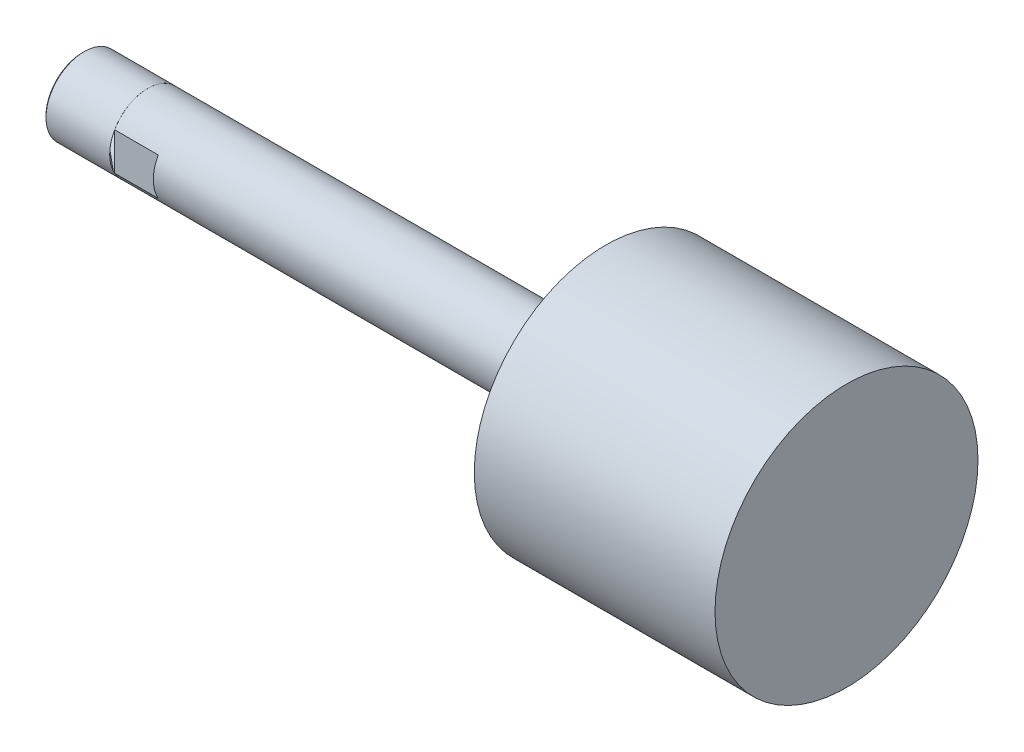
ISO-10303-21;
HEADER;
FILE_DESCRIPTION(('STEP AP214'),'2;1');
FILE_NAME('part.step','',(''),(''),'','','');
FILE_SCHEMA(('AUTOMOTIVE_DESIGN { 1 0 10303 214 1 1 1 1 }'));
ENDSEC;
DATA;
#1=APPLICATION_CONTEXT('core data for automotive mechanical design processes');
#2=APPLICATION_PROTOCOL_DEFINITION('international standard','automotive_design',2000,#1);
#3=PRODUCT_CONTEXT('',#1,'mechanical');
#4=PRODUCT('Part','Part','',(#3));
#5=PRODUCT_RELATED_PRODUCT_CATEGORY('part','',(#4));
#6=PRODUCT_DEFINITION_FORMATION('','',#4);
#7=PRODUCT_DEFINITION_CONTEXT('part definition',#1,'design');
#8=PRODUCT_DEFINITION('design','',#6,#7);
#9=PRODUCT_DEFINITION_SHAPE('','',#8);
#10=(LENGTH_UNIT() NAMED_UNIT(*) SI_UNIT(.MILLI.,.METRE.));
#11=(NAMED_UNIT(*) PLANE_ANGLE_UNIT() SI_UNIT($,.RADIAN.));
#12=(NAMED_UNIT(*) SI_UNIT($,.STERADIAN.) SOLID_ANGLE_UNIT());
#13=UNCERTAINTY_MEASURE_WITH_UNIT(LENGTH_MEASURE(1.E-05),#10,'distance_accuracy_value','');
#14=(GEOMETRIC_REPRESENTATION_CONTEXT(3) GLOBAL_UNCERTAINTY_ASSIGNED_CONTEXT((#13)) GLOBAL_UNIT_ASSIGNED_CONTEXT((#10,
#11,#12)) REPRESENTATION_CONTEXT('',''));
#15=CARTESIAN_POINT('',(0.,0.,0.));
#16=DIRECTION('',(0.,0.,1.));
#17=DIRECTION('',(1.,0.,0.));
#18=AXIS2_PLACEMENT_3D('',#15,#16,#17);
#19=CARTESIAN_POINT('',(-6.35,0.,0.));
#20=DIRECTION('',(-1.,0.,0.));
#21=DIRECTION('',(0.,0.,1.));
#22=AXIS2_PLACEMENT_3D('',#19,#20,#21);
#23=CYLINDRICAL_SURFACE('',#22,5.55625);
#24=CARTESIAN_POINT('',(-15.621,0.,0.));
#25=DIRECTION('',(-1.,0.,0.));
#26=DIRECTION('',(0.,0.,1.));
#27=AXIS2_PLACEMENT_3D('',#24,#25,#26);
#28=CIRCLE('',#27,5.55625);
#29=CARTESIAN_POINT('',(-15.621,0.,5.55625));
#30=VERTEX_POINT('',#29);
#31=EDGE_CURVE('E44',#30,#30,#28,.F.);
#32=ORIENTED_EDGE('',*,*,#31,.T.);
#33=EDGE_LOOP('',(#32));
#34=FACE_BOUND('',#33,.T.);
#35=CARTESIAN_POINT('',(-6.35,0.,0.));
#36=DIRECTION('',(-1.,0.,0.));
#37=DIRECTION('',(0.,0.,1.));
#38=AXIS2_PLACEMENT_3D('',#35,#36,#37);
#39=CIRCLE('',#38,5.55625);
#40=CARTESIAN_POINT('',(-6.35,0.,5.55625));
#41=VERTEX_POINT('',#40);
#42=EDGE_CURVE('E82',#41,#41,#39,.T.);
#43=ORIENTED_EDGE('',*,*,#42,.T.);
#44=EDGE_LOOP('',(#43));
#45=FACE_BOUND('',#44,.T.);
#46=ADVANCED_FACE('F35',(#34,#45),#23,.T.);
#47=CARTESIAN_POINT('',(0.,0.,0.));
#48=DIRECTION('',(1.,0.,0.));
#49=DIRECTION('',(0.,0.,-1.));
#50=AXIS2_PLACEMENT_3D('',#47,#48,#49);
#51=PLANE('',#50);
#52=CARTESIAN_POINT('',(0.,0.,0.));
#53=DIRECTION('',(-1.,0.,0.));
#54=DIRECTION('',(0.,0.,1.));
#55=AXIS2_PLACEMENT_3D('',#52,#53,#54);
#56=CIRCLE('',#55,5.5499);
#57=CARTESIAN_POINT('',(0.,2.74064116768321,4.826));
#58=VERTEX_POINT('',#57);
#59=CARTESIAN_POINT('',(0.,-2.74064116768321,4.826));
#60=VERTEX_POINT('',#59);
#61=EDGE_CURVE('E91',#58,#60,#56,.F.);
#62=ORIENTED_EDGE('',*,*,#61,.F.);
#63=DIRECTION('',(0.,1.,0.));
#64=VECTOR('',#63,1.);
#65=CARTESIAN_POINT('',(0.,5.5499,4.826));
#66=LINE('',#65,#64);
#67=EDGE_CURVE('E83',#58,#60,#66,.F.);
#68=ORIENTED_EDGE('',*,*,#67,.T.);
#69=EDGE_LOOP('',(#62,#68));
#70=FACE_BOUND('',#69,.T.);
#71=ADVANCED_FACE('F128',(#70),#51,.F.);
#72=CARTESIAN_POINT('',(0.,5.5499,4.826));
#73=DIRECTION('',(0.,0.,-1.));
#74=DIRECTION('',(-1.,0.,0.));
#75=AXIS2_PLACEMENT_3D('',#72,#73,#74);
#76=PLANE('',#75);
#77=DIRECTION('',(-1.,0.,0.));
#78=VECTOR('',#77,1.);
#79=CARTESIAN_POINT('',(95.377,-2.74064116768321,4.826));
#80=LINE('',#79,#78);
#81=CARTESIAN_POINT('',(-6.35,-2.74064116768321,4.826));
#82=VERTEX_POINT('',#81);
#83=EDGE_CURVE('E123',#60,#82,#80,.T.);
#84=ORIENTED_EDGE('',*,*,#83,.F.);
#85=ORIENTED_EDGE('',*,*,#67,.F.);
#86=DIRECTION('',(-1.,0.,0.));
#87=VECTOR('',#86,1.);
#88=CARTESIAN_POINT('',(95.377,2.74064116768321,4.826));
#89=LINE('',#88,#87);
#90=CARTESIAN_POINT('',(-6.35,2.74064116768321,4.826));
#91=VERTEX_POINT('',#90);
#92=EDGE_CURVE('E86',#91,#58,#89,.F.);
#93=ORIENTED_EDGE('',*,*,#92,.F.);
#94=DIRECTION('',(0.,1.,0.));
#95=VECTOR('',#94,1.);
#96=CARTESIAN_POINT('',(-6.35,5.55625,4.826));
#97=LINE('',#96,#95);
#98=EDGE_CURVE('E74',#91,#82,#97,.F.);
#99=ORIENTED_EDGE('',*,*,#98,.T.);
#100=EDGE_LOOP('',(#84,#85,#93,#99));
#101=FACE_BOUND('',#100,.T.);
#102=ADVANCED_FACE('F87',(#101),#76,.F.);
#103=CARTESIAN_POINT('',(-6.35,5.55625,0.));
#104=DIRECTION('',(-1.,0.,0.));
#105=DIRECTION('',(0.,0.,1.));
#106=AXIS2_PLACEMENT_3D('',#103,#104,#105);
#107=PLANE('',#106);
#108=ORIENTED_EDGE('',*,*,#42,.F.);
#109=EDGE_LOOP('',(#108));
#110=FACE_BOUND('',#109,.T.);
#111=DIRECTION('',(0.,1.,0.));
#112=VECTOR('',#111,1.);
#113=CARTESIAN_POINT('',(-6.35,-5.5499,-4.826));
#114=LINE('',#113,#112);
#115=CARTESIAN_POINT('',(-6.35,2.74064116768321,-4.826));
#116=VERTEX_POINT('',#115);
#117=CARTESIAN_POINT('',(-6.34999999999999,-2.74064116768321,-4.826));
#118=VERTEX_POINT('',#117);
#119=EDGE_CURVE('E98',#116,#118,#114,.F.);
#120=ORIENTED_EDGE('',*,*,#119,.T.);
#121=CARTESIAN_POINT('',(-6.34999999999999,0.,0.));
#122=DIRECTION('',(-1.,0.,0.));
#123=DIRECTION('',(0.,0.,1.));
#124=AXIS2_PLACEMENT_3D('',#121,#122,#123);
#125=CIRCLE('',#124,5.5499);
#126=EDGE_CURVE('E78',#82,#118,#125,.F.);
#127=ORIENTED_EDGE('',*,*,#126,.F.);
#128=ORIENTED_EDGE('',*,*,#98,.F.);
#129=CARTESIAN_POINT('',(-6.34999999999999,0.,0.));
#130=DIRECTION('',(-1.,0.,0.));
#131=DIRECTION('',(0.,0.,1.));
#132=AXIS2_PLACEMENT_3D('',#129,#130,#131);
#133=CIRCLE('',#132,5.5499);
#134=EDGE_CURVE('E71',#116,#91,#133,.F.);
#135=ORIENTED_EDGE('',*,*,#134,.F.);
#136=EDGE_LOOP('',(#120,#127,#128,#135));
#137=FACE_BOUND('',#136,.T.);
#138=ADVANCED_FACE('F76',(#110,#137),#107,.F.);
#139=CARTESIAN_POINT('',(0.,0.,0.));
#140=DIRECTION('',(1.,0.,0.));
#141=DIRECTION('',(0.,0.,-1.));
#142=AXIS2_PLACEMENT_3D('',#139,#140,#141);
#143=PLANE('',#142);
#144=CARTESIAN_POINT('',(0.,0.,0.));
#145=DIRECTION('',(-1.,0.,0.));
#146=DIRECTION('',(0.,0.,1.));
#147=AXIS2_PLACEMENT_3D('',#144,#145,#146);
#148=CIRCLE('',#147,5.5499);
#149=CARTESIAN_POINT('',(0.,-2.74064116768321,-4.826));
#150=VERTEX_POINT('',#149);
#151=CARTESIAN_POINT('',(0.,2.74064116768321,-4.826));
#152=VERTEX_POINT('',#151);
#153=EDGE_CURVE('E121',#150,#152,#148,.F.);
#154=ORIENTED_EDGE('',*,*,#153,.F.);
#155=DIRECTION('',(0.,1.,0.));
#156=VECTOR('',#155,1.);
#157=CARTESIAN_POINT('',(0.,-5.5499,-4.826));
#158=LINE('',#157,#156);
#159=EDGE_CURVE('E51',#150,#152,#158,.T.);
#160=ORIENTED_EDGE('',*,*,#159,.T.);
#161=EDGE_LOOP('',(#154,#160));
#162=FACE_BOUND('',#161,.T.);
#163=ADVANCED_FACE('F163',(#162),#143,.F.);
#164=CARTESIAN_POINT('',(0.,-5.5499,-4.826));
#165=DIRECTION('',(0.,0.,1.));
#166=DIRECTION('',(1.,0.,0.));
#167=AXIS2_PLACEMENT_3D('',#164,#165,#166);
#168=PLANE('',#167);
#169=DIRECTION('',(-1.,0.,0.));
#170=VECTOR('',#169,1.);
#171=CARTESIAN_POINT('',(95.377,2.74064116768321,-4.826));
#172=LINE('',#171,#170);
#173=EDGE_CURVE('E97',#152,#116,#172,.T.);
#174=ORIENTED_EDGE('',*,*,#173,.F.);
#175=ORIENTED_EDGE('',*,*,#159,.F.);
#176=DIRECTION('',(-1.,0.,0.));
#177=VECTOR('',#176,1.);
#178=CARTESIAN_POINT('',(95.377,-2.74064116768321,-4.826));
#179=LINE('',#178,#177);
#180=EDGE_CURVE('E122',#118,#150,#179,.F.);
#181=ORIENTED_EDGE('',*,*,#180,.F.);
#182=ORIENTED_EDGE('',*,*,#119,.F.);
#183=EDGE_LOOP('',(#174,#175,#181,#182));
#184=FACE_BOUND('',#183,.T.);
#185=ADVANCED_FACE('F160',(#184),#168,.F.);
#186=CARTESIAN_POINT('',(95.377,0.,0.));
#187=DIRECTION('',(-1.,0.,0.));
#188=DIRECTION('',(0.,0.,1.));
#189=AXIS2_PLACEMENT_3D('',#186,#187,#188);
#190=CYLINDRICAL_SURFACE('',#189,5.5499);
#191=ORIENTED_EDGE('',*,*,#153,.T.);
#192=ORIENTED_EDGE('',*,*,#173,.T.);
#193=ORIENTED_EDGE('',*,*,#134,.T.);
#194=ORIENTED_EDGE('',*,*,#92,.T.);
#195=ORIENTED_EDGE('',*,*,#61,.T.);
#196=ORIENTED_EDGE('',*,*,#83,.T.);
#197=ORIENTED_EDGE('',*,*,#126,.T.);
#198=ORIENTED_EDGE('',*,*,#180,.T.);
#199=EDGE_LOOP('',(#191,#192,#193,#194,#195,#196,#197,#198));
#200=FACE_BOUND('',#199,.T.);
#201=CARTESIAN_POINT('',(60.325,0.,0.));
#202=DIRECTION('',(-1.,0.,0.));
#203=DIRECTION('',(0.,0.,1.));
#204=AXIS2_PLACEMENT_3D('',#201,#202,#203);
#205=CIRCLE('',#204,5.5499);
#206=CARTESIAN_POINT('',(60.325,0.,5.5499));
#207=VERTEX_POINT('',#206);
#208=EDGE_CURVE('E115',#207,#207,#205,.T.);
#209=ORIENTED_EDGE('',*,*,#208,.T.);
#210=EDGE_LOOP('',(#209));
#211=FACE_BOUND('',#210,.T.);
#212=ADVANCED_FACE('F95',(#200,#211),#190,.T.);
#213=CARTESIAN_POINT('',(95.377,19.14525,0.));
#214=DIRECTION('',(-1.,0.,0.));
#215=DIRECTION('',(0.,0.,1.));
#216=AXIS2_PLACEMENT_3D('',#213,#214,#215);
#217=PLANE('',#216);
#218=CARTESIAN_POINT('',(95.377,0.,0.));
#219=DIRECTION('',(-1.,0.,0.));
#220=DIRECTION('',(0.,0.,1.));
#221=AXIS2_PLACEMENT_3D('',#218,#219,#220);
#222=CIRCLE('',#221,19.14525);
#223=CARTESIAN_POINT('',(95.377,0.,19.14525));
#224=VERTEX_POINT('',#223);
#225=EDGE_CURVE('E110',#224,#224,#222,.T.);
#226=ORIENTED_EDGE('',*,*,#225,.F.);
#227=EDGE_LOOP('',(#226));
#228=FACE_BOUND('',#227,.T.);
#229=ADVANCED_FACE('F154',(#228),#217,.F.);
#230=CARTESIAN_POINT('',(60.325,5.5499,0.));
#231=DIRECTION('',(1.,0.,0.));
#232=DIRECTION('',(0.,0.,-1.));
#233=AXIS2_PLACEMENT_3D('',#230,#231,#232);
#234=PLANE('',#233);
#235=ORIENTED_EDGE('',*,*,#208,.F.);
#236=EDGE_LOOP('',(#235));
#237=FACE_BOUND('',#236,.T.);
#238=CARTESIAN_POINT('',(60.325,0.,0.));
#239=DIRECTION('',(-1.,0.,0.));
#240=DIRECTION('',(0.,0.,1.));
#241=AXIS2_PLACEMENT_3D('',#238,#239,#240);
#242=CIRCLE('',#241,19.14525);
#243=CARTESIAN_POINT('',(60.325,0.,19.14525));
#244=VERTEX_POINT('',#243);
#245=EDGE_CURVE('E106',#244,#244,#242,.F.);
#246=ORIENTED_EDGE('',*,*,#245,.F.);
#247=EDGE_LOOP('',(#246));
#248=FACE_BOUND('',#247,.T.);
#249=ADVANCED_FACE('F149',(#237,#248),#234,.F.);
#250=CARTESIAN_POINT('',(95.377,0.,0.));
#251=DIRECTION('',(-1.,0.,0.));
#252=DIRECTION('',(0.,0.,1.));
#253=AXIS2_PLACEMENT_3D('',#250,#251,#252);
#254=CYLINDRICAL_SURFACE('',#253,19.14525);
#255=ORIENTED_EDGE('',*,*,#245,.T.);
#256=EDGE_LOOP('',(#255));
#257=FACE_BOUND('',#256,.T.);
#258=ORIENTED_EDGE('',*,*,#225,.T.);
#259=EDGE_LOOP('',(#258));
#260=FACE_BOUND('',#259,.T.);
#261=ADVANCED_FACE('F139',(#257,#260),#254,.T.);
#262=CARTESIAN_POINT('',(-15.875,0.,0.));
#263=DIRECTION('',(-1.,0.,0.));
#264=DIRECTION('',(0.,0.,1.));
#265=AXIS2_PLACEMENT_3D('',#262,#263,#264);
#266=PLANE('',#265);
#267=CARTESIAN_POINT('',(-15.875,0.,0.));
#268=DIRECTION('',(-1.,0.,0.));
#269=DIRECTION('',(0.,0.,1.));
#270=AXIS2_PLACEMENT_3D('',#267,#268,#269);
#271=CIRCLE('',#270,5.30225000000001);
#272=CARTESIAN_POINT('',(-15.875,0.,5.30225000000001));
#273=VERTEX_POINT('',#272);
#274=EDGE_CURVE('E11',#273,#273,#271,.T.);
#275=ORIENTED_EDGE('',*,*,#274,.T.);
#276=EDGE_LOOP('',(#275));
#277=FACE_BOUND('',#276,.T.);
#278=ADVANCED_FACE('F131',(#277),#266,.T.);
#279=CARTESIAN_POINT('',(-15.621,0.,0.));
#280=DIRECTION('',(1.,0.,0.));
#281=DIRECTION('',(0.,0.,-1.));
#282=AXIS2_PLACEMENT_3D('',#279,#280,#281);
#283=CONICAL_SURFACE('',#282,5.55625,0.785398163397438);
#284=ORIENTED_EDGE('',*,*,#274,.F.);
#285=EDGE_LOOP('',(#284));
#286=FACE_BOUND('',#285,.T.);
#287=ORIENTED_EDGE('',*,*,#31,.F.);
#288=EDGE_LOOP('',(#287));
#289=FACE_BOUND('',#288,.T.);
#290=ADVANCED_FACE('F37',(#286,#289),#283,.T.);
#291=CLOSED_SHELL('',(#46,#71,#102,#138,#163,#185,#212,#229,#249,#261,#278,#290));
#292=MANIFOLD_SOLID_BREP('B2',#291);
#293=ADVANCED_BREP_SHAPE_REPRESENTATION('',(#18,#292),#14);
#294=SHAPE_DEFINITION_REPRESENTATION(#9,#293);
ENDSEC;
END-ISO-10303-21;
